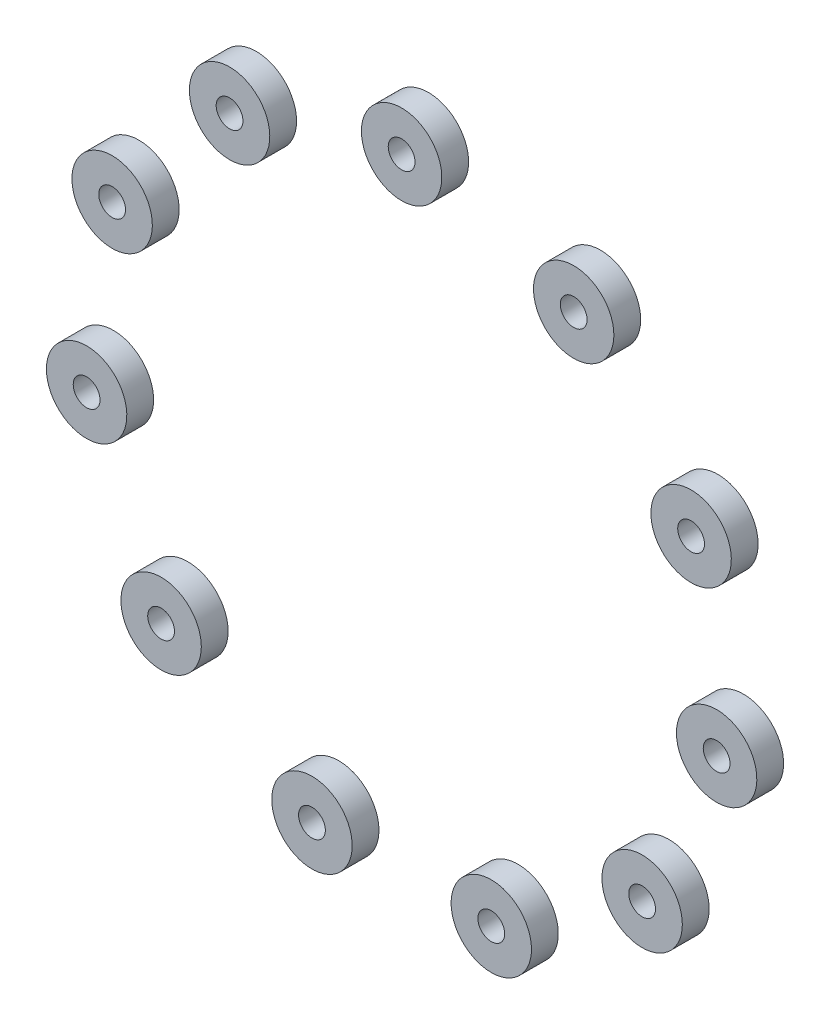
ISO-10303-21;
HEADER;
FILE_DESCRIPTION(('STEP AP214'),'2;1');
FILE_NAME('part.step','',(''),(''),'','','');
FILE_SCHEMA(('AUTOMOTIVE_DESIGN { 1 0 10303 214 1 1 1 1 }'));
ENDSEC;
DATA;
#1=APPLICATION_CONTEXT('core data for automotive mechanical design processes');
#2=APPLICATION_PROTOCOL_DEFINITION('international standard','automotive_design',2000,#1);
#3=PRODUCT_CONTEXT('',#1,'mechanical');
#4=PRODUCT('Part','Part','',(#3));
#5=PRODUCT_RELATED_PRODUCT_CATEGORY('part','',(#4));
#6=PRODUCT_DEFINITION_FORMATION('','',#4);
#7=PRODUCT_DEFINITION_CONTEXT('part definition',#1,'design');
#8=PRODUCT_DEFINITION('design','',#6,#7);
#9=PRODUCT_DEFINITION_SHAPE('','',#8);
#10=(LENGTH_UNIT() NAMED_UNIT(*) SI_UNIT(.MILLI.,.METRE.));
#11=(NAMED_UNIT(*) PLANE_ANGLE_UNIT() SI_UNIT($,.RADIAN.));
#12=(NAMED_UNIT(*) SI_UNIT($,.STERADIAN.) SOLID_ANGLE_UNIT());
#13=UNCERTAINTY_MEASURE_WITH_UNIT(LENGTH_MEASURE(1.E-05),#10,'distance_accuracy_value','');
#14=(GEOMETRIC_REPRESENTATION_CONTEXT(3) GLOBAL_UNCERTAINTY_ASSIGNED_CONTEXT((#13)) GLOBAL_UNIT_ASSIGNED_CONTEXT((#10,
#11,#12)) REPRESENTATION_CONTEXT('',''));
#15=CARTESIAN_POINT('',(0.,0.,0.));
#16=DIRECTION('',(0.,0.,1.));
#17=DIRECTION('',(1.,0.,0.));
#18=AXIS2_PLACEMENT_3D('',#15,#16,#17);
#19=CARTESIAN_POINT('',(0.,47.5,2.));
#20=DIRECTION('',(0.,0.,1.));
#21=DIRECTION('',(1.,0.,0.));
#22=AXIS2_PLACEMENT_3D('',#19,#20,#21);
#23=CYLINDRICAL_SURFACE('',#22,2.);
#24=CARTESIAN_POINT('',(0.,47.5,6.));
#25=DIRECTION('',(0.,0.,-1.));
#26=DIRECTION('',(1.,0.,0.));
#27=AXIS2_PLACEMENT_3D('',#24,#25,#26);
#28=CIRCLE('',#27,2.);
#29=CARTESIAN_POINT('',(-2.,47.5,6.));
#30=VERTEX_POINT('',#29);
#31=EDGE_CURVE('P0_E19',#30,#30,#28,.T.);
#32=ORIENTED_EDGE('',*,*,#31,.F.);
#33=DIRECTION('',(0.,0.,-1.));
#34=VECTOR('',#33,1.);
#35=CARTESIAN_POINT('',(-2.,47.5,2.));
#36=LINE('',#35,#34);
#37=CARTESIAN_POINT('',(-2.,47.5,2.));
#38=VERTEX_POINT('',#37);
#39=EDGE_CURVE('P0_E11',#30,#38,#36,.T.);
#40=ORIENTED_EDGE('',*,*,#39,.T.);
#41=CARTESIAN_POINT('',(0.,47.5,2.));
#42=DIRECTION('',(0.,0.,-1.));
#43=DIRECTION('',(1.,0.,0.));
#44=AXIS2_PLACEMENT_3D('',#41,#42,#43);
#45=CIRCLE('',#44,2.);
#46=EDGE_CURVE('P0_E26',#38,#38,#45,.T.);
#47=ORIENTED_EDGE('',*,*,#46,.T.);
#48=ORIENTED_EDGE('',*,*,#39,.F.);
#49=EDGE_LOOP('',(#32,#40,#47,#48));
#50=FACE_BOUND('',#49,.T.);
#51=ADVANCED_FACE('P0_F16',(#50),#23,.F.);
#52=CARTESIAN_POINT('',(0.,47.5,2.));
#53=DIRECTION('',(0.,0.,1.));
#54=DIRECTION('',(1.,0.,0.));
#55=AXIS2_PLACEMENT_3D('',#52,#53,#54);
#56=CYLINDRICAL_SURFACE('',#55,6.);
#57=CARTESIAN_POINT('',(0.,47.5,6.));
#58=DIRECTION('',(0.,0.,1.));
#59=DIRECTION('',(1.,0.,0.));
#60=AXIS2_PLACEMENT_3D('',#57,#58,#59);
#61=CIRCLE('',#60,6.);
#62=CARTESIAN_POINT('',(-6.,47.5,6.));
#63=VERTEX_POINT('',#62);
#64=EDGE_CURVE('P0_E56',#63,#63,#61,.T.);
#65=ORIENTED_EDGE('',*,*,#64,.F.);
#66=DIRECTION('',(0.,0.,-1.));
#67=VECTOR('',#66,1.);
#68=CARTESIAN_POINT('',(-6.,47.5,2.));
#69=LINE('',#68,#67);
#70=CARTESIAN_POINT('',(-6.,47.5,2.));
#71=VERTEX_POINT('',#70);
#72=EDGE_CURVE('P0_E58',#63,#71,#69,.T.);
#73=ORIENTED_EDGE('',*,*,#72,.T.);
#74=CARTESIAN_POINT('',(0.,47.5,2.));
#75=DIRECTION('',(0.,0.,1.));
#76=DIRECTION('',(1.,0.,0.));
#77=AXIS2_PLACEMENT_3D('',#74,#75,#76);
#78=CIRCLE('',#77,6.);
#79=EDGE_CURVE('P0_E47',#71,#71,#78,.T.);
#80=ORIENTED_EDGE('',*,*,#79,.T.);
#81=ORIENTED_EDGE('',*,*,#72,.F.);
#82=EDGE_LOOP('',(#65,#73,#80,#81));
#83=FACE_BOUND('',#82,.T.);
#84=ADVANCED_FACE('P0_F57',(#83),#56,.T.);
#85=CARTESIAN_POINT('',(0.,47.5,6.));
#86=DIRECTION('',(0.,0.,1.));
#87=DIRECTION('',(1.,0.,0.));
#88=AXIS2_PLACEMENT_3D('',#85,#86,#87);
#89=PLANE('',#88);
#90=ORIENTED_EDGE('',*,*,#64,.T.);
#91=EDGE_LOOP('',(#90));
#92=FACE_BOUND('',#91,.T.);
#93=ORIENTED_EDGE('',*,*,#31,.T.);
#94=EDGE_LOOP('',(#93));
#95=FACE_BOUND('',#94,.T.);
#96=ADVANCED_FACE('P0_F79',(#92,#95),#89,.T.);
#97=CARTESIAN_POINT('',(0.,47.5,2.));
#98=DIRECTION('',(0.,0.,1.));
#99=DIRECTION('',(1.,0.,0.));
#100=AXIS2_PLACEMENT_3D('',#97,#98,#99);
#101=PLANE('',#100);
#102=ORIENTED_EDGE('',*,*,#79,.F.);
#103=EDGE_LOOP('',(#102));
#104=FACE_BOUND('',#103,.T.);
#105=ORIENTED_EDGE('',*,*,#46,.F.);
#106=EDGE_LOOP('',(#105));
#107=FACE_BOUND('',#106,.T.);
#108=ADVANCED_FACE('P0_F77',(#104,#107),#101,.F.);
#109=CLOSED_SHELL('',(#51,#84,#96,#108));
#110=MANIFOLD_SOLID_BREP('P0_B1',#109);
#111=CARTESIAN_POINT('',(-25.6804388291409,39.9595428094811,2.));
#112=DIRECTION('',(0.,0.,1.));
#113=DIRECTION('',(0.841253532831181,0.540640817455598,0.));
#114=AXIS2_PLACEMENT_3D('',#111,#112,#113);
#115=CYLINDRICAL_SURFACE('',#114,2.);
#116=CARTESIAN_POINT('',(-25.6804388291409,39.9595428094811,6.));
#117=DIRECTION('',(0.,0.,-1.));
#118=DIRECTION('',(0.841253532831181,0.540640817455598,0.));
#119=AXIS2_PLACEMENT_3D('',#116,#117,#118);
#120=CIRCLE('',#119,2.);
#121=CARTESIAN_POINT('',(-27.3629458948032,38.8782611745699,6.));
#122=VERTEX_POINT('',#121);
#123=EDGE_CURVE('P1_E19',#122,#122,#120,.T.);
#124=ORIENTED_EDGE('',*,*,#123,.F.);
#125=DIRECTION('',(0.,0.,-1.));
#126=VECTOR('',#125,1.);
#127=CARTESIAN_POINT('',(-27.3629458948032,38.8782611745699,2.));
#128=LINE('',#127,#126);
#129=CARTESIAN_POINT('',(-27.3629458948032,38.8782611745699,2.));
#130=VERTEX_POINT('',#129);
#131=EDGE_CURVE('P1_E11',#122,#130,#128,.T.);
#132=ORIENTED_EDGE('',*,*,#131,.T.);
#133=CARTESIAN_POINT('',(-25.6804388291409,39.9595428094811,2.));
#134=DIRECTION('',(0.,0.,-1.));
#135=DIRECTION('',(0.841253532831181,0.540640817455598,0.));
#136=AXIS2_PLACEMENT_3D('',#133,#134,#135);
#137=CIRCLE('',#136,2.);
#138=EDGE_CURVE('P1_E26',#130,#130,#137,.T.);
#139=ORIENTED_EDGE('',*,*,#138,.T.);
#140=ORIENTED_EDGE('',*,*,#131,.F.);
#141=EDGE_LOOP('',(#124,#132,#139,#140));
#142=FACE_BOUND('',#141,.T.);
#143=ADVANCED_FACE('P1_F16',(#142),#115,.F.);
#144=CARTESIAN_POINT('',(-25.6804388291409,39.9595428094811,2.));
#145=DIRECTION('',(0.,0.,1.));
#146=DIRECTION('',(0.841253532831181,0.540640817455598,0.));
#147=AXIS2_PLACEMENT_3D('',#144,#145,#146);
#148=CYLINDRICAL_SURFACE('',#147,6.);
#149=CARTESIAN_POINT('',(-25.6804388291409,39.9595428094811,6.));
#150=DIRECTION('',(0.,0.,1.));
#151=DIRECTION('',(0.841253532831181,0.540640817455598,0.));
#152=AXIS2_PLACEMENT_3D('',#149,#150,#151);
#153=CIRCLE('',#152,6.);
#154=CARTESIAN_POINT('',(-30.727960026128,36.7156979047475,6.));
#155=VERTEX_POINT('',#154);
#156=EDGE_CURVE('P1_E56',#155,#155,#153,.T.);
#157=ORIENTED_EDGE('',*,*,#156,.F.);
#158=DIRECTION('',(0.,0.,-1.));
#159=VECTOR('',#158,1.);
#160=CARTESIAN_POINT('',(-30.727960026128,36.7156979047475,2.));
#161=LINE('',#160,#159);
#162=CARTESIAN_POINT('',(-30.727960026128,36.7156979047475,2.));
#163=VERTEX_POINT('',#162);
#164=EDGE_CURVE('P1_E58',#155,#163,#161,.T.);
#165=ORIENTED_EDGE('',*,*,#164,.T.);
#166=CARTESIAN_POINT('',(-25.6804388291409,39.9595428094811,2.));
#167=DIRECTION('',(0.,0.,1.));
#168=DIRECTION('',(0.841253532831181,0.540640817455598,0.));
#169=AXIS2_PLACEMENT_3D('',#166,#167,#168);
#170=CIRCLE('',#169,6.);
#171=EDGE_CURVE('P1_E47',#163,#163,#170,.T.);
#172=ORIENTED_EDGE('',*,*,#171,.T.);
#173=ORIENTED_EDGE('',*,*,#164,.F.);
#174=EDGE_LOOP('',(#157,#165,#172,#173));
#175=FACE_BOUND('',#174,.T.);
#176=ADVANCED_FACE('P1_F57',(#175),#148,.T.);
#177=CARTESIAN_POINT('',(-25.6804388291409,39.9595428094811,6.));
#178=DIRECTION('',(0.,0.,1.));
#179=DIRECTION('',(1.,0.,0.));
#180=AXIS2_PLACEMENT_3D('',#177,#178,#179);
#181=PLANE('',#180);
#182=ORIENTED_EDGE('',*,*,#156,.T.);
#183=EDGE_LOOP('',(#182));
#184=FACE_BOUND('',#183,.T.);
#185=ORIENTED_EDGE('',*,*,#123,.T.);
#186=EDGE_LOOP('',(#185));
#187=FACE_BOUND('',#186,.T.);
#188=ADVANCED_FACE('P1_F77',(#184,#187),#181,.T.);
#189=CARTESIAN_POINT('',(-25.6804388291409,39.9595428094811,2.));
#190=DIRECTION('',(0.,0.,1.));
#191=DIRECTION('',(1.,0.,0.));
#192=AXIS2_PLACEMENT_3D('',#189,#190,#191);
#193=PLANE('',#192);
#194=ORIENTED_EDGE('',*,*,#171,.F.);
#195=EDGE_LOOP('',(#194));
#196=FACE_BOUND('',#195,.T.);
#197=ORIENTED_EDGE('',*,*,#138,.F.);
#198=EDGE_LOOP('',(#197));
#199=FACE_BOUND('',#198,.T.);
#200=ADVANCED_FACE('P1_F75',(#196,#199),#193,.F.);
#201=CLOSED_SHELL('',(#143,#176,#188,#200));
#202=MANIFOLD_SOLID_BREP('P1_B1',#201);
#203=CARTESIAN_POINT('',(-47.0165184893443,-6.75995481798104,2.));
#204=DIRECTION('',(0.,0.,1.));
#205=DIRECTION('',(-0.142314838273285,0.989821441880933,0.));
#206=AXIS2_PLACEMENT_3D('',#203,#204,#205);
#207=CYLINDRICAL_SURFACE('',#206,2.);
#208=CARTESIAN_POINT('',(-47.0165184893443,-6.75995481798104,6.));
#209=DIRECTION('',(0.,0.,-1.));
#210=DIRECTION('',(-0.142314838273285,0.989821441880933,0.));
#211=AXIS2_PLACEMENT_3D('',#208,#209,#210);
#212=CIRCLE('',#211,2.);
#213=CARTESIAN_POINT('',(-46.7318888127977,-8.7395977017429,6.));
#214=VERTEX_POINT('',#213);
#215=EDGE_CURVE('P2_E38',#214,#214,#212,.T.);
#216=ORIENTED_EDGE('',*,*,#215,.F.);
#217=DIRECTION('',(0.,0.,-1.));
#218=VECTOR('',#217,1.);
#219=CARTESIAN_POINT('',(-46.7318888127977,-8.7395977017429,2.));
#220=LINE('',#219,#218);
#221=CARTESIAN_POINT('',(-46.7318888127977,-8.7395977017429,2.));
#222=VERTEX_POINT('',#221);
#223=EDGE_CURVE('P2_E11',#214,#222,#220,.T.);
#224=ORIENTED_EDGE('',*,*,#223,.T.);
#225=CARTESIAN_POINT('',(-47.0165184893443,-6.75995481798104,2.));
#226=DIRECTION('',(0.,0.,-1.));
#227=DIRECTION('',(-0.142314838273285,0.989821441880933,0.));
#228=AXIS2_PLACEMENT_3D('',#225,#226,#227);
#229=CIRCLE('',#228,2.);
#230=EDGE_CURVE('P2_E26',#222,#222,#229,.T.);
#231=ORIENTED_EDGE('',*,*,#230,.T.);
#232=ORIENTED_EDGE('',*,*,#223,.F.);
#233=EDGE_LOOP('',(#216,#224,#231,#232));
#234=FACE_BOUND('',#233,.T.);
#235=ADVANCED_FACE('P2_F16',(#234),#207,.F.);
#236=CARTESIAN_POINT('',(-47.0165184893443,-6.75995481798104,2.));
#237=DIRECTION('',(0.,0.,1.));
#238=DIRECTION('',(-0.142314838273285,0.989821441880933,0.));
#239=AXIS2_PLACEMENT_3D('',#236,#237,#238);
#240=CYLINDRICAL_SURFACE('',#239,6.);
#241=CARTESIAN_POINT('',(-47.0165184893443,-6.75995481798104,6.));
#242=DIRECTION('',(0.,0.,1.));
#243=DIRECTION('',(-0.142314838273285,0.989821441880933,0.));
#244=AXIS2_PLACEMENT_3D('',#241,#242,#243);
#245=CIRCLE('',#244,6.);
#246=CARTESIAN_POINT('',(-46.1626294597046,-12.6988834692666,6.));
#247=VERTEX_POINT('',#246);
#248=EDGE_CURVE('P2_E19',#247,#247,#245,.T.);
#249=ORIENTED_EDGE('',*,*,#248,.F.);
#250=DIRECTION('',(0.,0.,-1.));
#251=VECTOR('',#250,1.);
#252=CARTESIAN_POINT('',(-46.1626294597046,-12.6988834692666,2.));
#253=LINE('',#252,#251);
#254=CARTESIAN_POINT('',(-46.1626294597046,-12.6988834692666,2.));
#255=VERTEX_POINT('',#254);
#256=EDGE_CURVE('P2_E56',#247,#255,#253,.T.);
#257=ORIENTED_EDGE('',*,*,#256,.T.);
#258=CARTESIAN_POINT('',(-47.0165184893443,-6.75995481798104,2.));
#259=DIRECTION('',(0.,0.,1.));
#260=DIRECTION('',(-0.142314838273285,0.989821441880933,0.));
#261=AXIS2_PLACEMENT_3D('',#258,#259,#260);
#262=CIRCLE('',#261,6.);
#263=EDGE_CURVE('P2_E47',#255,#255,#262,.T.);
#264=ORIENTED_EDGE('',*,*,#263,.T.);
#265=ORIENTED_EDGE('',*,*,#256,.F.);
#266=EDGE_LOOP('',(#249,#257,#264,#265));
#267=FACE_BOUND('',#266,.T.);
#268=ADVANCED_FACE('P2_F55',(#267),#240,.T.);
#269=CARTESIAN_POINT('',(-47.0165184893443,-6.75995481798104,6.));
#270=DIRECTION('',(0.,0.,1.));
#271=DIRECTION('',(1.,0.,0.));
#272=AXIS2_PLACEMENT_3D('',#269,#270,#271);
#273=PLANE('',#272);
#274=ORIENTED_EDGE('',*,*,#248,.T.);
#275=EDGE_LOOP('',(#274));
#276=FACE_BOUND('',#275,.T.);
#277=ORIENTED_EDGE('',*,*,#215,.T.);
#278=EDGE_LOOP('',(#277));
#279=FACE_BOUND('',#278,.T.);
#280=ADVANCED_FACE('P2_F96',(#276,#279),#273,.T.);
#281=CARTESIAN_POINT('',(-47.0165184893443,-6.75995481798104,2.));
#282=DIRECTION('',(0.,0.,1.));
#283=DIRECTION('',(1.,0.,0.));
#284=AXIS2_PLACEMENT_3D('',#281,#282,#283);
#285=PLANE('',#284);
#286=ORIENTED_EDGE('',*,*,#263,.F.);
#287=EDGE_LOOP('',(#286));
#288=FACE_BOUND('',#287,.T.);
#289=ORIENTED_EDGE('',*,*,#230,.F.);
#290=EDGE_LOOP('',(#289));
#291=FACE_BOUND('',#290,.T.);
#292=ADVANCED_FACE('P2_F92',(#288,#291),#285,.F.);
#293=CLOSED_SHELL('',(#235,#268,#280,#292));
#294=MANIFOLD_SOLID_BREP('P2_B1',#293);
#295=CARTESIAN_POINT('',(-35.8981047818273,-31.105884862401,2.));
#296=DIRECTION('',(0.,0.,1.));
#297=DIRECTION('',(-0.654860733945285,0.755749574354258,0.));
#298=AXIS2_PLACEMENT_3D('',#295,#296,#297);
#299=CYLINDRICAL_SURFACE('',#298,2.);
#300=CARTESIAN_POINT('',(-35.8981047818273,-31.105884862401,6.));
#301=DIRECTION('',(0.,0.,-1.));
#302=DIRECTION('',(-0.654860733945285,0.755749574354258,0.));
#303=AXIS2_PLACEMENT_3D('',#300,#301,#302);
#304=CIRCLE('',#303,2.);
#305=CARTESIAN_POINT('',(-34.5883833139367,-32.6173840111096,6.));
#306=VERTEX_POINT('',#305);
#307=EDGE_CURVE('P3_E36',#306,#306,#304,.T.);
#308=ORIENTED_EDGE('',*,*,#307,.F.);
#309=DIRECTION('',(0.,0.,-1.));
#310=VECTOR('',#309,1.);
#311=CARTESIAN_POINT('',(-34.5883833139367,-32.6173840111096,2.));
#312=LINE('',#311,#310);
#313=CARTESIAN_POINT('',(-34.5883833139367,-32.6173840111096,2.));
#314=VERTEX_POINT('',#313);
#315=EDGE_CURVE('P3_E11',#306,#314,#312,.T.);
#316=ORIENTED_EDGE('',*,*,#315,.T.);
#317=CARTESIAN_POINT('',(-35.8981047818273,-31.105884862401,2.));
#318=DIRECTION('',(0.,0.,-1.));
#319=DIRECTION('',(-0.654860733945285,0.755749574354258,0.));
#320=AXIS2_PLACEMENT_3D('',#317,#318,#319);
#321=CIRCLE('',#320,2.);
#322=EDGE_CURVE('P3_E20',#314,#314,#321,.T.);
#323=ORIENTED_EDGE('',*,*,#322,.T.);
#324=ORIENTED_EDGE('',*,*,#315,.F.);
#325=EDGE_LOOP('',(#308,#316,#323,#324));
#326=FACE_BOUND('',#325,.T.);
#327=ADVANCED_FACE('P3_F16',(#326),#299,.F.);
#328=CARTESIAN_POINT('',(-35.8981047818273,-31.105884862401,2.));
#329=DIRECTION('',(0.,0.,1.));
#330=DIRECTION('',(-0.654860733945285,0.755749574354258,0.));
#331=AXIS2_PLACEMENT_3D('',#328,#329,#330);
#332=CYLINDRICAL_SURFACE('',#331,6.);
#333=CARTESIAN_POINT('',(-35.8981047818273,-31.105884862401,6.));
#334=DIRECTION('',(0.,0.,1.));
#335=DIRECTION('',(-0.654860733945285,0.755749574354258,0.));
#336=AXIS2_PLACEMENT_3D('',#333,#334,#335);
#337=CIRCLE('',#336,6.);
#338=CARTESIAN_POINT('',(-31.9689403781556,-35.6403823085266,6.));
#339=VERTEX_POINT('',#338);
#340=EDGE_CURVE('P3_E59',#339,#339,#337,.T.);
#341=ORIENTED_EDGE('',*,*,#340,.F.);
#342=DIRECTION('',(0.,0.,-1.));
#343=VECTOR('',#342,1.);
#344=CARTESIAN_POINT('',(-31.9689403781556,-35.6403823085266,2.));
#345=LINE('',#344,#343);
#346=CARTESIAN_POINT('',(-31.9689403781556,-35.6403823085266,2.));
#347=VERTEX_POINT('',#346);
#348=EDGE_CURVE('P3_E58',#339,#347,#345,.T.);
#349=ORIENTED_EDGE('',*,*,#348,.T.);
#350=CARTESIAN_POINT('',(-35.8981047818273,-31.105884862401,2.));
#351=DIRECTION('',(0.,0.,1.));
#352=DIRECTION('',(-0.654860733945285,0.755749574354258,0.));
#353=AXIS2_PLACEMENT_3D('',#350,#351,#352);
#354=CIRCLE('',#353,6.);
#355=EDGE_CURVE('P3_E52',#347,#347,#354,.T.);
#356=ORIENTED_EDGE('',*,*,#355,.T.);
#357=ORIENTED_EDGE('',*,*,#348,.F.);
#358=EDGE_LOOP('',(#341,#349,#356,#357));
#359=FACE_BOUND('',#358,.T.);
#360=ADVANCED_FACE('P3_F61',(#359),#332,.T.);
#361=CARTESIAN_POINT('',(-35.8981047818273,-31.105884862401,6.));
#362=DIRECTION('',(0.,0.,1.));
#363=DIRECTION('',(1.,0.,0.));
#364=AXIS2_PLACEMENT_3D('',#361,#362,#363);
#365=PLANE('',#364);
#366=ORIENTED_EDGE('',*,*,#340,.T.);
#367=EDGE_LOOP('',(#366));
#368=FACE_BOUND('',#367,.T.);
#369=ORIENTED_EDGE('',*,*,#307,.T.);
#370=EDGE_LOOP('',(#369));
#371=FACE_BOUND('',#370,.T.);
#372=ADVANCED_FACE('P3_F18',(#368,#371),#365,.T.);
#373=CARTESIAN_POINT('',(-35.8981047818273,-31.105884862401,2.));
#374=DIRECTION('',(0.,0.,1.));
#375=DIRECTION('',(1.,0.,0.));
#376=AXIS2_PLACEMENT_3D('',#373,#374,#375);
#377=PLANE('',#376);
#378=ORIENTED_EDGE('',*,*,#355,.F.);
#379=EDGE_LOOP('',(#378));
#380=FACE_BOUND('',#379,.T.);
#381=ORIENTED_EDGE('',*,*,#322,.F.);
#382=EDGE_LOOP('',(#381));
#383=FACE_BOUND('',#382,.T.);
#384=ADVANCED_FACE('P3_F54',(#380,#383),#377,.F.);
#385=CLOSED_SHELL('',(#327,#360,#372,#384));
#386=MANIFOLD_SOLID_BREP('P3_B1',#385);
#387=CARTESIAN_POINT('',(-13.3822964499679,-45.5759162466886,2.));
#388=DIRECTION('',(0.,0.,1.));
#389=DIRECTION('',(-0.959492973614497,0.28173255684143,0.));
#390=AXIS2_PLACEMENT_3D('',#387,#388,#389);
#391=CYLINDRICAL_SURFACE('',#390,2.);
#392=CARTESIAN_POINT('',(-13.3822964499679,-45.5759162466886,6.));
#393=DIRECTION('',(0.,0.,-1.));
#394=DIRECTION('',(-0.959492973614497,0.28173255684143,0.));
#395=AXIS2_PLACEMENT_3D('',#392,#393,#394);
#396=CIRCLE('',#395,2.);
#397=CARTESIAN_POINT('',(-11.4633105027389,-46.1393813603715,6.));
#398=VERTEX_POINT('',#397);
#399=EDGE_CURVE('P4_E37',#398,#398,#396,.T.);
#400=ORIENTED_EDGE('',*,*,#399,.F.);
#401=DIRECTION('',(0.,0.,-1.));
#402=VECTOR('',#401,1.);
#403=CARTESIAN_POINT('',(-11.4633105027389,-46.1393813603715,2.));
#404=LINE('',#403,#402);
#405=CARTESIAN_POINT('',(-11.4633105027389,-46.1393813603715,2.));
#406=VERTEX_POINT('',#405);
#407=EDGE_CURVE('P4_E11',#398,#406,#404,.T.);
#408=ORIENTED_EDGE('',*,*,#407,.T.);
#409=CARTESIAN_POINT('',(-13.3822964499679,-45.5759162466886,2.));
#410=DIRECTION('',(0.,0.,-1.));
#411=DIRECTION('',(-0.959492973614497,0.28173255684143,0.));
#412=AXIS2_PLACEMENT_3D('',#409,#410,#411);
#413=CIRCLE('',#412,2.);
#414=EDGE_CURVE('P4_E26',#406,#406,#413,.T.);
#415=ORIENTED_EDGE('',*,*,#414,.T.);
#416=ORIENTED_EDGE('',*,*,#407,.F.);
#417=EDGE_LOOP('',(#400,#408,#415,#416));
#418=FACE_BOUND('',#417,.T.);
#419=ADVANCED_FACE('P4_F16',(#418),#391,.F.);
#420=CARTESIAN_POINT('',(-13.3822964499679,-45.5759162466886,2.));
#421=DIRECTION('',(0.,0.,1.));
#422=DIRECTION('',(-0.959492973614497,0.28173255684143,0.));
#423=AXIS2_PLACEMENT_3D('',#420,#421,#422);
#424=CYLINDRICAL_SURFACE('',#423,6.);
#425=CARTESIAN_POINT('',(-13.3822964499679,-45.5759162466886,6.));
#426=DIRECTION('',(0.,0.,1.));
#427=DIRECTION('',(-0.959492973614497,0.28173255684143,0.));
#428=AXIS2_PLACEMENT_3D('',#425,#426,#427);
#429=CIRCLE('',#428,6.);
#430=CARTESIAN_POINT('',(-7.62533860828093,-47.2663115877372,6.));
#431=VERTEX_POINT('',#430);
#432=EDGE_CURVE('P4_E49',#431,#431,#429,.T.);
#433=ORIENTED_EDGE('',*,*,#432,.F.);
#434=DIRECTION('',(0.,0.,-1.));
#435=VECTOR('',#434,1.);
#436=CARTESIAN_POINT('',(-7.62533860828093,-47.2663115877372,2.));
#437=LINE('',#436,#435);
#438=CARTESIAN_POINT('',(-7.62533860828093,-47.2663115877372,2.));
#439=VERTEX_POINT('',#438);
#440=EDGE_CURVE('P4_E58',#431,#439,#437,.T.);
#441=ORIENTED_EDGE('',*,*,#440,.T.);
#442=CARTESIAN_POINT('',(-13.3822964499679,-45.5759162466886,2.));
#443=DIRECTION('',(0.,0.,1.));
#444=DIRECTION('',(-0.959492973614497,0.28173255684143,0.));
#445=AXIS2_PLACEMENT_3D('',#442,#443,#444);
#446=CIRCLE('',#445,6.);
#447=EDGE_CURVE('P4_E55',#439,#439,#446,.T.);
#448=ORIENTED_EDGE('',*,*,#447,.T.);
#449=ORIENTED_EDGE('',*,*,#440,.F.);
#450=EDGE_LOOP('',(#433,#441,#448,#449));
#451=FACE_BOUND('',#450,.T.);
#452=ADVANCED_FACE('P4_F60',(#451),#424,.T.);
#453=CARTESIAN_POINT('',(-13.3822964499679,-45.5759162466886,6.));
#454=DIRECTION('',(0.,0.,1.));
#455=DIRECTION('',(1.,0.,0.));
#456=AXIS2_PLACEMENT_3D('',#453,#454,#455);
#457=PLANE('',#456);
#458=ORIENTED_EDGE('',*,*,#432,.T.);
#459=EDGE_LOOP('',(#458));
#460=FACE_BOUND('',#459,.T.);
#461=ORIENTED_EDGE('',*,*,#399,.T.);
#462=EDGE_LOOP('',(#461));
#463=FACE_BOUND('',#462,.T.);
#464=ADVANCED_FACE('P4_F75',(#460,#463),#457,.T.);
#465=CARTESIAN_POINT('',(-13.3822964499679,-45.5759162466886,2.));
#466=DIRECTION('',(0.,0.,1.));
#467=DIRECTION('',(1.,0.,0.));
#468=AXIS2_PLACEMENT_3D('',#465,#466,#467);
#469=PLANE('',#468);
#470=ORIENTED_EDGE('',*,*,#447,.F.);
#471=EDGE_LOOP('',(#470));
#472=FACE_BOUND('',#471,.T.);
#473=ORIENTED_EDGE('',*,*,#414,.F.);
#474=EDGE_LOOP('',(#473));
#475=FACE_BOUND('',#474,.T.);
#476=ADVANCED_FACE('P4_F18',(#472,#475),#469,.F.);
#477=CLOSED_SHELL('',(#419,#452,#464,#476));
#478=MANIFOLD_SOLID_BREP('P4_B1',#477);
#479=CARTESIAN_POINT('',(35.8981047818273,-31.105884862401,2.));
#480=DIRECTION('',(0.,0.,1.));
#481=DIRECTION('',(-0.654860733945285,-0.755749574354258,0.));
#482=AXIS2_PLACEMENT_3D('',#479,#480,#481);
#483=CYLINDRICAL_SURFACE('',#482,2.);
#484=CARTESIAN_POINT('',(35.8981047818273,-31.105884862401,6.));
#485=DIRECTION('',(0.,0.,-1.));
#486=DIRECTION('',(-0.654860733945285,-0.755749574354258,0.));
#487=AXIS2_PLACEMENT_3D('',#484,#485,#486);
#488=CIRCLE('',#487,2.);
#489=CARTESIAN_POINT('',(37.2078262497178,-29.5943857136925,6.));
#490=VERTEX_POINT('',#489);
#491=EDGE_CURVE('P5_E40',#490,#490,#488,.T.);
#492=ORIENTED_EDGE('',*,*,#491,.F.);
#493=DIRECTION('',(0.,0.,-1.));
#494=VECTOR('',#493,1.);
#495=CARTESIAN_POINT('',(37.2078262497178,-29.5943857136925,2.));
#496=LINE('',#495,#494);
#497=CARTESIAN_POINT('',(37.2078262497178,-29.5943857136925,2.));
#498=VERTEX_POINT('',#497);
#499=EDGE_CURVE('P5_E11',#490,#498,#496,.T.);
#500=ORIENTED_EDGE('',*,*,#499,.T.);
#501=CARTESIAN_POINT('',(35.8981047818273,-31.105884862401,2.));
#502=DIRECTION('',(0.,0.,-1.));
#503=DIRECTION('',(-0.654860733945285,-0.755749574354258,0.));
#504=AXIS2_PLACEMENT_3D('',#501,#502,#503);
#505=CIRCLE('',#504,2.);
#506=EDGE_CURVE('P5_E27',#498,#498,#505,.T.);
#507=ORIENTED_EDGE('',*,*,#506,.T.);
#508=ORIENTED_EDGE('',*,*,#499,.F.);
#509=EDGE_LOOP('',(#492,#500,#507,#508));
#510=FACE_BOUND('',#509,.T.);
#511=ADVANCED_FACE('P5_F16',(#510),#483,.F.);
#512=CARTESIAN_POINT('',(35.8981047818273,-31.105884862401,2.));
#513=DIRECTION('',(0.,0.,1.));
#514=DIRECTION('',(-0.654860733945285,-0.755749574354258,0.));
#515=AXIS2_PLACEMENT_3D('',#512,#513,#514);
#516=CYLINDRICAL_SURFACE('',#515,6.);
#517=CARTESIAN_POINT('',(35.8981047818273,-31.105884862401,6.));
#518=DIRECTION('',(0.,0.,1.));
#519=DIRECTION('',(-0.654860733945285,-0.755749574354258,0.));
#520=AXIS2_PLACEMENT_3D('',#517,#518,#519);
#521=CIRCLE('',#520,6.);
#522=CARTESIAN_POINT('',(39.827269185499,-26.5713874162755,6.));
#523=VERTEX_POINT('',#522);
#524=EDGE_CURVE('P5_E20',#523,#523,#521,.T.);
#525=ORIENTED_EDGE('',*,*,#524,.F.);
#526=DIRECTION('',(0.,0.,-1.));
#527=VECTOR('',#526,1.);
#528=CARTESIAN_POINT('',(39.827269185499,-26.5713874162755,2.));
#529=LINE('',#528,#527);
#530=CARTESIAN_POINT('',(39.827269185499,-26.5713874162755,2.));
#531=VERTEX_POINT('',#530);
#532=EDGE_CURVE('P5_E59',#523,#531,#529,.T.);
#533=ORIENTED_EDGE('',*,*,#532,.T.);
#534=CARTESIAN_POINT('',(35.8981047818273,-31.105884862401,2.));
#535=DIRECTION('',(0.,0.,1.));
#536=DIRECTION('',(-0.654860733945285,-0.755749574354258,0.));
#537=AXIS2_PLACEMENT_3D('',#534,#535,#536);
#538=CIRCLE('',#537,6.);
#539=EDGE_CURVE('P5_E49',#531,#531,#538,.T.);
#540=ORIENTED_EDGE('',*,*,#539,.T.);
#541=ORIENTED_EDGE('',*,*,#532,.F.);
#542=EDGE_LOOP('',(#525,#533,#540,#541));
#543=FACE_BOUND('',#542,.T.);
#544=ADVANCED_FACE('P5_F58',(#543),#516,.T.);
#545=CARTESIAN_POINT('',(35.8981047818273,-31.105884862401,6.));
#546=DIRECTION('',(0.,0.,1.));
#547=DIRECTION('',(1.,0.,0.));
#548=AXIS2_PLACEMENT_3D('',#545,#546,#547);
#549=PLANE('',#548);
#550=ORIENTED_EDGE('',*,*,#524,.T.);
#551=EDGE_LOOP('',(#550));
#552=FACE_BOUND('',#551,.T.);
#553=ORIENTED_EDGE('',*,*,#491,.T.);
#554=EDGE_LOOP('',(#553));
#555=FACE_BOUND('',#554,.T.);
#556=ADVANCED_FACE('P5_F18',(#552,#555),#549,.T.);
#557=CARTESIAN_POINT('',(35.8981047818273,-31.105884862401,2.));
#558=DIRECTION('',(0.,0.,1.));
#559=DIRECTION('',(1.,0.,0.));
#560=AXIS2_PLACEMENT_3D('',#557,#558,#559);
#561=PLANE('',#560);
#562=ORIENTED_EDGE('',*,*,#539,.F.);
#563=EDGE_LOOP('',(#562));
#564=FACE_BOUND('',#563,.T.);
#565=ORIENTED_EDGE('',*,*,#506,.F.);
#566=EDGE_LOOP('',(#565));
#567=FACE_BOUND('',#566,.T.);
#568=ADVANCED_FACE('P5_F93',(#564,#567),#561,.F.);
#569=CLOSED_SHELL('',(#511,#544,#556,#568));
#570=MANIFOLD_SOLID_BREP('P5_B1',#569);
#571=CARTESIAN_POINT('',(25.6804388291409,39.9595428094811,2.));
#572=DIRECTION('',(0.,0.,1.));
#573=DIRECTION('',(0.841253532831181,-0.540640817455598,0.));
#574=AXIS2_PLACEMENT_3D('',#571,#572,#573);
#575=CYLINDRICAL_SURFACE('',#574,2.);
#576=CARTESIAN_POINT('',(25.6804388291409,39.9595428094811,6.));
#577=DIRECTION('',(0.,0.,-1.));
#578=DIRECTION('',(0.841253532831181,-0.540640817455598,0.));
#579=AXIS2_PLACEMENT_3D('',#576,#577,#578);
#580=CIRCLE('',#579,2.);
#581=CARTESIAN_POINT('',(23.9979317634785,41.0408244443923,6.));
#582=VERTEX_POINT('',#581);
#583=EDGE_CURVE('P6_E35',#582,#582,#580,.T.);
#584=ORIENTED_EDGE('',*,*,#583,.F.);
#585=DIRECTION('',(0.,0.,-1.));
#586=VECTOR('',#585,1.);
#587=CARTESIAN_POINT('',(23.9979317634785,41.0408244443923,2.));
#588=LINE('',#587,#586);
#589=CARTESIAN_POINT('',(23.9979317634785,41.0408244443923,2.));
#590=VERTEX_POINT('',#589);
#591=EDGE_CURVE('P6_E11',#582,#590,#588,.T.);
#592=ORIENTED_EDGE('',*,*,#591,.T.);
#593=CARTESIAN_POINT('',(25.6804388291409,39.9595428094811,2.));
#594=DIRECTION('',(0.,0.,-1.));
#595=DIRECTION('',(0.841253532831181,-0.540640817455598,0.));
#596=AXIS2_PLACEMENT_3D('',#593,#594,#595);
#597=CIRCLE('',#596,2.);
#598=EDGE_CURVE('P6_E24',#590,#590,#597,.T.);
#599=ORIENTED_EDGE('',*,*,#598,.T.);
#600=ORIENTED_EDGE('',*,*,#591,.F.);
#601=EDGE_LOOP('',(#584,#592,#599,#600));
#602=FACE_BOUND('',#601,.T.);
#603=ADVANCED_FACE('P6_F16',(#602),#575,.F.);
#604=CARTESIAN_POINT('',(25.6804388291409,39.9595428094811,2.));
#605=DIRECTION('',(0.,0.,1.));
#606=DIRECTION('',(0.841253532831181,-0.540640817455598,0.));
#607=AXIS2_PLACEMENT_3D('',#604,#605,#606);
#608=CYLINDRICAL_SURFACE('',#607,6.);
#609=CARTESIAN_POINT('',(25.6804388291409,39.9595428094811,6.));
#610=DIRECTION('',(0.,0.,1.));
#611=DIRECTION('',(0.841253532831181,-0.540640817455598,0.));
#612=AXIS2_PLACEMENT_3D('',#609,#610,#611);
#613=CIRCLE('',#612,6.);
#614=CARTESIAN_POINT('',(20.6329176321538,43.2033877142147,6.));
#615=VERTEX_POINT('',#614);
#616=EDGE_CURVE('P6_E58',#615,#615,#613,.T.);
#617=ORIENTED_EDGE('',*,*,#616,.F.);
#618=DIRECTION('',(0.,0.,-1.));
#619=VECTOR('',#618,1.);
#620=CARTESIAN_POINT('',(20.6329176321538,43.2033877142147,2.));
#621=LINE('',#620,#619);
#622=CARTESIAN_POINT('',(20.6329176321538,43.2033877142147,2.));
#623=VERTEX_POINT('',#622);
#624=EDGE_CURVE('P6_E57',#615,#623,#621,.T.);
#625=ORIENTED_EDGE('',*,*,#624,.T.);
#626=CARTESIAN_POINT('',(25.6804388291409,39.9595428094811,2.));
#627=DIRECTION('',(0.,0.,1.));
#628=DIRECTION('',(0.841253532831181,-0.540640817455598,0.));
#629=AXIS2_PLACEMENT_3D('',#626,#627,#628);
#630=CIRCLE('',#629,6.);
#631=EDGE_CURVE('P6_E51',#623,#623,#630,.T.);
#632=ORIENTED_EDGE('',*,*,#631,.T.);
#633=ORIENTED_EDGE('',*,*,#624,.F.);
#634=EDGE_LOOP('',(#617,#625,#632,#633));
#635=FACE_BOUND('',#634,.T.);
#636=ADVANCED_FACE('P6_F60',(#635),#608,.T.);
#637=CARTESIAN_POINT('',(25.6804388291409,39.9595428094811,6.));
#638=DIRECTION('',(0.,0.,1.));
#639=DIRECTION('',(1.,0.,0.));
#640=AXIS2_PLACEMENT_3D('',#637,#638,#639);
#641=PLANE('',#640);
#642=ORIENTED_EDGE('',*,*,#616,.T.);
#643=EDGE_LOOP('',(#642));
#644=FACE_BOUND('',#643,.T.);
#645=ORIENTED_EDGE('',*,*,#583,.T.);
#646=EDGE_LOOP('',(#645));
#647=FACE_BOUND('',#646,.T.);
#648=ADVANCED_FACE('P6_F78',(#644,#647),#641,.T.);
#649=CARTESIAN_POINT('',(25.6804388291409,39.9595428094811,2.));
#650=DIRECTION('',(0.,0.,1.));
#651=DIRECTION('',(1.,0.,0.));
#652=AXIS2_PLACEMENT_3D('',#649,#650,#651);
#653=PLANE('',#652);
#654=ORIENTED_EDGE('',*,*,#631,.F.);
#655=EDGE_LOOP('',(#654));
#656=FACE_BOUND('',#655,.T.);
#657=ORIENTED_EDGE('',*,*,#598,.F.);
#658=EDGE_LOOP('',(#657));
#659=FACE_BOUND('',#658,.T.);
#660=ADVANCED_FACE('P6_F53',(#656,#659),#653,.F.);
#661=CLOSED_SHELL('',(#603,#636,#648,#660));
#662=MANIFOLD_SOLID_BREP('P6_B1',#661);
#663=CARTESIAN_POINT('',(47.0165184893443,-6.75995481798105,2.));
#664=DIRECTION('',(0.,0.,1.));
#665=DIRECTION('',(-0.142314838273285,-0.989821441880933,0.));
#666=AXIS2_PLACEMENT_3D('',#663,#664,#665);
#667=CYLINDRICAL_SURFACE('',#666,2.);
#668=CARTESIAN_POINT('',(47.0165184893443,-6.75995481798105,6.));
#669=DIRECTION('',(0.,0.,-1.));
#670=DIRECTION('',(-0.142314838273285,-0.989821441880933,0.));
#671=AXIS2_PLACEMENT_3D('',#668,#669,#670);
#672=CIRCLE('',#671,2.);
#673=CARTESIAN_POINT('',(47.3011481658909,-4.78031193421918,6.));
#674=VERTEX_POINT('',#673);
#675=EDGE_CURVE('P7_E39',#674,#674,#672,.T.);
#676=ORIENTED_EDGE('',*,*,#675,.F.);
#677=DIRECTION('',(0.,0.,-1.));
#678=VECTOR('',#677,1.);
#679=CARTESIAN_POINT('',(47.3011481658909,-4.78031193421918,2.));
#680=LINE('',#679,#678);
#681=CARTESIAN_POINT('',(47.3011481658909,-4.78031193421918,2.));
#682=VERTEX_POINT('',#681);
#683=EDGE_CURVE('P7_E11',#674,#682,#680,.T.);
#684=ORIENTED_EDGE('',*,*,#683,.T.);
#685=CARTESIAN_POINT('',(47.0165184893443,-6.75995481798105,2.));
#686=DIRECTION('',(0.,0.,-1.));
#687=DIRECTION('',(-0.142314838273285,-0.989821441880933,0.));
#688=AXIS2_PLACEMENT_3D('',#685,#686,#687);
#689=CIRCLE('',#688,2.);
#690=EDGE_CURVE('P7_E27',#682,#682,#689,.T.);
#691=ORIENTED_EDGE('',*,*,#690,.T.);
#692=ORIENTED_EDGE('',*,*,#683,.F.);
#693=EDGE_LOOP('',(#676,#684,#691,#692));
#694=FACE_BOUND('',#693,.T.);
#695=ADVANCED_FACE('P7_F16',(#694),#667,.F.);
#696=CARTESIAN_POINT('',(47.0165184893443,-6.75995481798105,2.));
#697=DIRECTION('',(0.,0.,1.));
#698=DIRECTION('',(-0.142314838273285,-0.989821441880933,0.));
#699=AXIS2_PLACEMENT_3D('',#696,#697,#698);
#700=CYLINDRICAL_SURFACE('',#699,6.);
#701=CARTESIAN_POINT('',(47.0165184893443,-6.75995481798105,6.));
#702=DIRECTION('',(0.,0.,1.));
#703=DIRECTION('',(-0.142314838273285,-0.989821441880933,0.));
#704=AXIS2_PLACEMENT_3D('',#701,#702,#703);
#705=CIRCLE('',#704,6.);
#706=CARTESIAN_POINT('',(47.870407518984,-0.821026166695452,6.));
#707=VERTEX_POINT('',#706);
#708=EDGE_CURVE('P7_E20',#707,#707,#705,.T.);
#709=ORIENTED_EDGE('',*,*,#708,.F.);
#710=DIRECTION('',(0.,0.,-1.));
#711=VECTOR('',#710,1.);
#712=CARTESIAN_POINT('',(47.870407518984,-0.821026166695452,2.));
#713=LINE('',#712,#711);
#714=CARTESIAN_POINT('',(47.870407518984,-0.821026166695452,2.));
#715=VERTEX_POINT('',#714);
#716=EDGE_CURVE('P7_E60',#707,#715,#713,.T.);
#717=ORIENTED_EDGE('',*,*,#716,.T.);
#718=CARTESIAN_POINT('',(47.0165184893443,-6.75995481798105,2.));
#719=DIRECTION('',(0.,0.,1.));
#720=DIRECTION('',(-0.142314838273285,-0.989821441880933,0.));
#721=AXIS2_PLACEMENT_3D('',#718,#719,#720);
#722=CIRCLE('',#721,6.);
#723=EDGE_CURVE('P7_E56',#715,#715,#722,.T.);
#724=ORIENTED_EDGE('',*,*,#723,.T.);
#725=ORIENTED_EDGE('',*,*,#716,.F.);
#726=EDGE_LOOP('',(#709,#717,#724,#725));
#727=FACE_BOUND('',#726,.T.);
#728=ADVANCED_FACE('P7_F62',(#727),#700,.T.);
#729=CARTESIAN_POINT('',(47.0165184893443,-6.75995481798105,6.));
#730=DIRECTION('',(0.,0.,1.));
#731=DIRECTION('',(1.,0.,0.));
#732=AXIS2_PLACEMENT_3D('',#729,#730,#731);
#733=PLANE('',#732);
#734=ORIENTED_EDGE('',*,*,#708,.T.);
#735=EDGE_LOOP('',(#734));
#736=FACE_BOUND('',#735,.T.);
#737=ORIENTED_EDGE('',*,*,#675,.T.);
#738=EDGE_LOOP('',(#737));
#739=FACE_BOUND('',#738,.T.);
#740=ADVANCED_FACE('P7_F18',(#736,#739),#733,.T.);
#741=CARTESIAN_POINT('',(47.0165184893443,-6.75995481798105,2.));
#742=DIRECTION('',(0.,0.,1.));
#743=DIRECTION('',(1.,0.,0.));
#744=AXIS2_PLACEMENT_3D('',#741,#742,#743);
#745=PLANE('',#744);
#746=ORIENTED_EDGE('',*,*,#723,.F.);
#747=EDGE_LOOP('',(#746));
#748=FACE_BOUND('',#747,.T.);
#749=ORIENTED_EDGE('',*,*,#690,.F.);
#750=EDGE_LOOP('',(#749));
#751=FACE_BOUND('',#750,.T.);
#752=ADVANCED_FACE('P7_F57',(#748,#751),#745,.F.);
#753=CLOSED_SHELL('',(#695,#728,#740,#752));
#754=MANIFOLD_SOLID_BREP('P7_B1',#753);
#755=CARTESIAN_POINT('',(13.3822964499679,-45.5759162466886,2.));
#756=DIRECTION('',(0.,0.,1.));
#757=DIRECTION('',(-0.959492973614498,-0.281732556841429,0.));
#758=AXIS2_PLACEMENT_3D('',#755,#756,#757);
#759=CYLINDRICAL_SURFACE('',#758,2.);
#760=CARTESIAN_POINT('',(13.3822964499679,-45.5759162466886,6.));
#761=DIRECTION('',(0.,0.,-1.));
#762=DIRECTION('',(-0.959492973614498,-0.281732556841429,0.));
#763=AXIS2_PLACEMENT_3D('',#760,#761,#762);
#764=CIRCLE('',#763,2.);
#765=CARTESIAN_POINT('',(15.3012823971969,-45.0124511330058,6.));
#766=VERTEX_POINT('',#765);
#767=EDGE_CURVE('P8_E20',#766,#766,#764,.T.);
#768=ORIENTED_EDGE('',*,*,#767,.F.);
#769=DIRECTION('',(0.,0.,-1.));
#770=VECTOR('',#769,1.);
#771=CARTESIAN_POINT('',(15.3012823971969,-45.0124511330058,2.));
#772=LINE('',#771,#770);
#773=CARTESIAN_POINT('',(15.3012823971969,-45.0124511330058,2.));
#774=VERTEX_POINT('',#773);
#775=EDGE_CURVE('P8_E11',#766,#774,#772,.T.);
#776=ORIENTED_EDGE('',*,*,#775,.T.);
#777=CARTESIAN_POINT('',(13.3822964499679,-45.5759162466886,2.));
#778=DIRECTION('',(0.,0.,-1.));
#779=DIRECTION('',(-0.959492973614498,-0.281732556841429,0.));
#780=AXIS2_PLACEMENT_3D('',#777,#778,#779);
#781=CIRCLE('',#780,2.);
#782=EDGE_CURVE('P8_E27',#774,#774,#781,.T.);
#783=ORIENTED_EDGE('',*,*,#782,.T.);
#784=ORIENTED_EDGE('',*,*,#775,.F.);
#785=EDGE_LOOP('',(#768,#776,#783,#784));
#786=FACE_BOUND('',#785,.T.);
#787=ADVANCED_FACE('P8_F16',(#786),#759,.F.);
#788=CARTESIAN_POINT('',(13.3822964499679,-45.5759162466886,2.));
#789=DIRECTION('',(0.,0.,1.));
#790=DIRECTION('',(-0.959492973614498,-0.281732556841429,0.));
#791=AXIS2_PLACEMENT_3D('',#788,#789,#790);
#792=CYLINDRICAL_SURFACE('',#791,6.);
#793=CARTESIAN_POINT('',(13.3822964499679,-45.5759162466886,6.));
#794=DIRECTION('',(0.,0.,1.));
#795=DIRECTION('',(-0.959492973614498,-0.281732556841429,0.));
#796=AXIS2_PLACEMENT_3D('',#793,#794,#795);
#797=CIRCLE('',#796,6.);
#798=CARTESIAN_POINT('',(19.1392542916549,-43.88552090564,6.));
#799=VERTEX_POINT('',#798);
#800=EDGE_CURVE('P8_E57',#799,#799,#797,.T.);
#801=ORIENTED_EDGE('',*,*,#800,.F.);
#802=DIRECTION('',(0.,0.,-1.));
#803=VECTOR('',#802,1.);
#804=CARTESIAN_POINT('',(19.1392542916549,-43.88552090564,2.));
#805=LINE('',#804,#803);
#806=CARTESIAN_POINT('',(19.1392542916549,-43.88552090564,2.));
#807=VERTEX_POINT('',#806);
#808=EDGE_CURVE('P8_E56',#799,#807,#805,.T.);
#809=ORIENTED_EDGE('',*,*,#808,.T.);
#810=CARTESIAN_POINT('',(13.3822964499679,-45.5759162466886,2.));
#811=DIRECTION('',(0.,0.,1.));
#812=DIRECTION('',(-0.959492973614498,-0.281732556841429,0.));
#813=AXIS2_PLACEMENT_3D('',#810,#811,#812);
#814=CIRCLE('',#813,6.);
#815=EDGE_CURVE('P8_E49',#807,#807,#814,.T.);
#816=ORIENTED_EDGE('',*,*,#815,.T.);
#817=ORIENTED_EDGE('',*,*,#808,.F.);
#818=EDGE_LOOP('',(#801,#809,#816,#817));
#819=FACE_BOUND('',#818,.T.);
#820=ADVANCED_FACE('P8_F59',(#819),#792,.T.);
#821=CARTESIAN_POINT('',(13.3822964499679,-45.5759162466886,6.));
#822=DIRECTION('',(0.,0.,1.));
#823=DIRECTION('',(1.,0.,0.));
#824=AXIS2_PLACEMENT_3D('',#821,#822,#823);
#825=PLANE('',#824);
#826=ORIENTED_EDGE('',*,*,#800,.T.);
#827=EDGE_LOOP('',(#826));
#828=FACE_BOUND('',#827,.T.);
#829=ORIENTED_EDGE('',*,*,#767,.T.);
#830=EDGE_LOOP('',(#829));
#831=FACE_BOUND('',#830,.T.);
#832=ADVANCED_FACE('P8_F18',(#828,#831),#825,.T.);
#833=CARTESIAN_POINT('',(13.3822964499679,-45.5759162466886,2.));
#834=DIRECTION('',(0.,0.,1.));
#835=DIRECTION('',(1.,0.,0.));
#836=AXIS2_PLACEMENT_3D('',#833,#834,#835);
#837=PLANE('',#836);
#838=ORIENTED_EDGE('',*,*,#815,.F.);
#839=EDGE_LOOP('',(#838));
#840=FACE_BOUND('',#839,.T.);
#841=ORIENTED_EDGE('',*,*,#782,.F.);
#842=EDGE_LOOP('',(#841));
#843=FACE_BOUND('',#842,.T.);
#844=ADVANCED_FACE('P8_F51',(#840,#843),#837,.F.);
#845=CLOSED_SHELL('',(#787,#820,#832,#844));
#846=MANIFOLD_SOLID_BREP('P8_B1',#845);
#847=CARTESIAN_POINT('',(43.2075197793396,19.7322131175896,2.));
#848=DIRECTION('',(0.,0.,1.));
#849=DIRECTION('',(0.415415013001886,-0.909631995354519,0.));
#850=AXIS2_PLACEMENT_3D('',#847,#848,#849);
#851=CYLINDRICAL_SURFACE('',#850,2.);
#852=CARTESIAN_POINT('',(43.2075197793396,19.7322131175896,6.));
#853=DIRECTION('',(0.,0.,-1.));
#854=DIRECTION('',(0.415415013001886,-0.909631995354519,0.));
#855=AXIS2_PLACEMENT_3D('',#852,#853,#854);
#856=CIRCLE('',#855,2.);
#857=CARTESIAN_POINT('',(42.3766897533359,21.5514771082986,6.));
#858=VERTEX_POINT('',#857);
#859=EDGE_CURVE('P9_E39',#858,#858,#856,.T.);
#860=ORIENTED_EDGE('',*,*,#859,.F.);
#861=DIRECTION('',(0.,0.,-1.));
#862=VECTOR('',#861,1.);
#863=CARTESIAN_POINT('',(42.3766897533359,21.5514771082986,2.));
#864=LINE('',#863,#862);
#865=CARTESIAN_POINT('',(42.3766897533359,21.5514771082986,2.));
#866=VERTEX_POINT('',#865);
#867=EDGE_CURVE('P9_E11',#858,#866,#864,.T.);
#868=ORIENTED_EDGE('',*,*,#867,.T.);
#869=CARTESIAN_POINT('',(43.2075197793396,19.7322131175896,2.));
#870=DIRECTION('',(0.,0.,-1.));
#871=DIRECTION('',(0.415415013001886,-0.909631995354519,0.));
#872=AXIS2_PLACEMENT_3D('',#869,#870,#871);
#873=CIRCLE('',#872,2.);
#874=EDGE_CURVE('P9_E20',#866,#866,#873,.T.);
#875=ORIENTED_EDGE('',*,*,#874,.T.);
#876=ORIENTED_EDGE('',*,*,#867,.F.);
#877=EDGE_LOOP('',(#860,#868,#875,#876));
#878=FACE_BOUND('',#877,.T.);
#879=ADVANCED_FACE('P9_F16',(#878),#851,.F.);
#880=CARTESIAN_POINT('',(43.2075197793396,19.7322131175896,2.));
#881=DIRECTION('',(0.,0.,1.));
#882=DIRECTION('',(0.415415013001886,-0.909631995354519,0.));
#883=AXIS2_PLACEMENT_3D('',#880,#881,#882);
#884=CYLINDRICAL_SURFACE('',#883,6.);
#885=CARTESIAN_POINT('',(43.2075197793396,19.7322131175896,6.));
#886=DIRECTION('',(0.,0.,1.));
#887=DIRECTION('',(0.415415013001886,-0.909631995354518,0.));
#888=AXIS2_PLACEMENT_3D('',#885,#886,#887);
#889=CIRCLE('',#888,6.);
#890=CARTESIAN_POINT('',(40.7150297013283,25.1900050897167,6.));
#891=VERTEX_POINT('',#890);
#892=EDGE_CURVE('P9_E50',#891,#891,#889,.T.);
#893=ORIENTED_EDGE('',*,*,#892,.F.);
#894=DIRECTION('',(0.,0.,-1.));
#895=VECTOR('',#894,1.);
#896=CARTESIAN_POINT('',(40.7150297013283,25.1900050897167,2.));
#897=LINE('',#896,#895);
#898=CARTESIAN_POINT('',(40.7150297013283,25.1900050897167,2.));
#899=VERTEX_POINT('',#898);
#900=EDGE_CURVE('P9_E60',#891,#899,#897,.T.);
#901=ORIENTED_EDGE('',*,*,#900,.T.);
#902=CARTESIAN_POINT('',(43.2075197793396,19.7322131175896,2.));
#903=DIRECTION('',(0.,0.,1.));
#904=DIRECTION('',(0.415415013001886,-0.909631995354518,0.));
#905=AXIS2_PLACEMENT_3D('',#902,#903,#904);
#906=CIRCLE('',#905,6.);
#907=EDGE_CURVE('P9_E56',#899,#899,#906,.T.);
#908=ORIENTED_EDGE('',*,*,#907,.T.);
#909=ORIENTED_EDGE('',*,*,#900,.F.);
#910=EDGE_LOOP('',(#893,#901,#908,#909));
#911=FACE_BOUND('',#910,.T.);
#912=ADVANCED_FACE('P9_F18',(#911),#884,.T.);
#913=CARTESIAN_POINT('',(43.2075197793396,19.7322131175896,6.));
#914=DIRECTION('',(0.,0.,1.));
#915=DIRECTION('',(1.,0.,0.));
#916=AXIS2_PLACEMENT_3D('',#913,#914,#915);
#917=PLANE('',#916);
#918=ORIENTED_EDGE('',*,*,#892,.T.);
#919=EDGE_LOOP('',(#918));
#920=FACE_BOUND('',#919,.T.);
#921=ORIENTED_EDGE('',*,*,#859,.T.);
#922=EDGE_LOOP('',(#921));
#923=FACE_BOUND('',#922,.T.);
#924=ADVANCED_FACE('P9_F75',(#920,#923),#917,.T.);
#925=CARTESIAN_POINT('',(43.2075197793396,19.7322131175896,2.));
#926=DIRECTION('',(0.,0.,1.));
#927=DIRECTION('',(1.,0.,0.));
#928=AXIS2_PLACEMENT_3D('',#925,#926,#927);
#929=PLANE('',#928);
#930=ORIENTED_EDGE('',*,*,#907,.F.);
#931=EDGE_LOOP('',(#930));
#932=FACE_BOUND('',#931,.T.);
#933=ORIENTED_EDGE('',*,*,#874,.F.);
#934=EDGE_LOOP('',(#933));
#935=FACE_BOUND('',#934,.T.);
#936=ADVANCED_FACE('P9_F57',(#932,#935),#929,.F.);
#937=CLOSED_SHELL('',(#879,#912,#924,#936));
#938=MANIFOLD_SOLID_BREP('P9_B1',#937);
#939=CARTESIAN_POINT('',(-43.2075197793396,19.7322131175896,2.));
#940=DIRECTION('',(0.,0.,1.));
#941=DIRECTION('',(0.415415013001886,0.909631995354519,0.));
#942=AXIS2_PLACEMENT_3D('',#939,#940,#941);
#943=CYLINDRICAL_SURFACE('',#942,2.);
#944=CARTESIAN_POINT('',(-43.2075197793396,19.7322131175896,6.));
#945=DIRECTION('',(0.,0.,-1.));
#946=DIRECTION('',(0.415415013001886,0.909631995354519,0.));
#947=AXIS2_PLACEMENT_3D('',#944,#945,#946);
#948=CIRCLE('',#947,2.);
#949=CARTESIAN_POINT('',(-44.0383498053434,17.9129491268806,6.));
#950=VERTEX_POINT('',#949);
#951=EDGE_CURVE('P10_E37',#950,#950,#948,.T.);
#952=ORIENTED_EDGE('',*,*,#951,.F.);
#953=DIRECTION('',(0.,0.,-1.));
#954=VECTOR('',#953,1.);
#955=CARTESIAN_POINT('',(-44.0383498053434,17.9129491268806,2.));
#956=LINE('',#955,#954);
#957=CARTESIAN_POINT('',(-44.0383498053434,17.9129491268806,2.));
#958=VERTEX_POINT('',#957);
#959=EDGE_CURVE('P10_E11',#950,#958,#956,.T.);
#960=ORIENTED_EDGE('',*,*,#959,.T.);
#961=CARTESIAN_POINT('',(-43.2075197793396,19.7322131175896,2.));
#962=DIRECTION('',(0.,0.,-1.));
#963=DIRECTION('',(0.415415013001886,0.909631995354519,0.));
#964=AXIS2_PLACEMENT_3D('',#961,#962,#963);
#965=CIRCLE('',#964,2.);
#966=EDGE_CURVE('P10_E20',#958,#958,#965,.T.);
#967=ORIENTED_EDGE('',*,*,#966,.T.);
#968=ORIENTED_EDGE('',*,*,#959,.F.);
#969=EDGE_LOOP('',(#952,#960,#967,#968));
#970=FACE_BOUND('',#969,.T.);
#971=ADVANCED_FACE('P10_F16',(#970),#943,.F.);
#972=CARTESIAN_POINT('',(-43.2075197793396,19.7322131175896,2.));
#973=DIRECTION('',(0.,0.,1.));
#974=DIRECTION('',(0.415415013001886,0.909631995354519,0.));
#975=AXIS2_PLACEMENT_3D('',#972,#973,#974);
#976=CYLINDRICAL_SURFACE('',#975,6.);
#977=CARTESIAN_POINT('',(-43.2075197793396,19.7322131175896,6.));
#978=DIRECTION('',(0.,0.,1.));
#979=DIRECTION('',(0.415415013001886,0.909631995354518,0.));
#980=AXIS2_PLACEMENT_3D('',#977,#978,#979);
#981=CIRCLE('',#980,6.);
#982=CARTESIAN_POINT('',(-45.7000098573509,14.2744211454625,6.));
#983=VERTEX_POINT('',#982);
#984=EDGE_CURVE('P10_E61',#983,#983,#981,.T.);
#985=ORIENTED_EDGE('',*,*,#984,.F.);
#986=DIRECTION('',(0.,0.,-1.));
#987=VECTOR('',#986,1.);
#988=CARTESIAN_POINT('',(-45.7000098573509,14.2744211454625,2.));
#989=LINE('',#988,#987);
#990=CARTESIAN_POINT('',(-45.7000098573509,14.2744211454625,2.));
#991=VERTEX_POINT('',#990);
#992=EDGE_CURVE('P10_E60',#983,#991,#989,.T.);
#993=ORIENTED_EDGE('',*,*,#992,.T.);
#994=CARTESIAN_POINT('',(-43.2075197793396,19.7322131175896,2.));
#995=DIRECTION('',(0.,0.,1.));
#996=DIRECTION('',(0.415415013001886,0.909631995354518,0.));
#997=AXIS2_PLACEMENT_3D('',#994,#995,#996);
#998=CIRCLE('',#997,6.);
#999=EDGE_CURVE('P10_E54',#991,#991,#998,.T.);
#1000=ORIENTED_EDGE('',*,*,#999,.T.);
#1001=ORIENTED_EDGE('',*,*,#992,.F.);
#1002=EDGE_LOOP('',(#985,#993,#1000,#1001));
#1003=FACE_BOUND('',#1002,.T.);
#1004=ADVANCED_FACE('P10_F18',(#1003),#976,.T.);
#1005=CARTESIAN_POINT('',(-43.2075197793396,19.7322131175896,6.));
#1006=DIRECTION('',(0.,0.,1.));
#1007=DIRECTION('',(1.,0.,0.));
#1008=AXIS2_PLACEMENT_3D('',#1005,#1006,#1007);
#1009=PLANE('',#1008);
#1010=ORIENTED_EDGE('',*,*,#984,.T.);
#1011=EDGE_LOOP('',(#1010));
#1012=FACE_BOUND('',#1011,.T.);
#1013=ORIENTED_EDGE('',*,*,#951,.T.);
#1014=EDGE_LOOP('',(#1013));
#1015=FACE_BOUND('',#1014,.T.);
#1016=ADVANCED_FACE('P10_F76',(#1012,#1015),#1009,.T.);
#1017=CARTESIAN_POINT('',(-43.2075197793396,19.7322131175896,2.));
#1018=DIRECTION('',(0.,0.,1.));
#1019=DIRECTION('',(1.,0.,0.));
#1020=AXIS2_PLACEMENT_3D('',#1017,#1018,#1019);
#1021=PLANE('',#1020);
#1022=ORIENTED_EDGE('',*,*,#999,.F.);
#1023=EDGE_LOOP('',(#1022));
#1024=FACE_BOUND('',#1023,.T.);
#1025=ORIENTED_EDGE('',*,*,#966,.F.);
#1026=EDGE_LOOP('',(#1025));
#1027=FACE_BOUND('',#1026,.T.);
#1028=ADVANCED_FACE('P10_F56',(#1024,#1027),#1021,.F.);
#1029=CLOSED_SHELL('',(#971,#1004,#1016,#1028));
#1030=MANIFOLD_SOLID_BREP('P10_B1',#1029);
#1031=ADVANCED_BREP_SHAPE_REPRESENTATION('',(#18,#110,#202,#294,#386,#478,#570,#662,#754,#846,
#938,#1030),#14);
#1032=SHAPE_DEFINITION_REPRESENTATION(#9,#1031);
ENDSEC;
END-ISO-10303-21;
